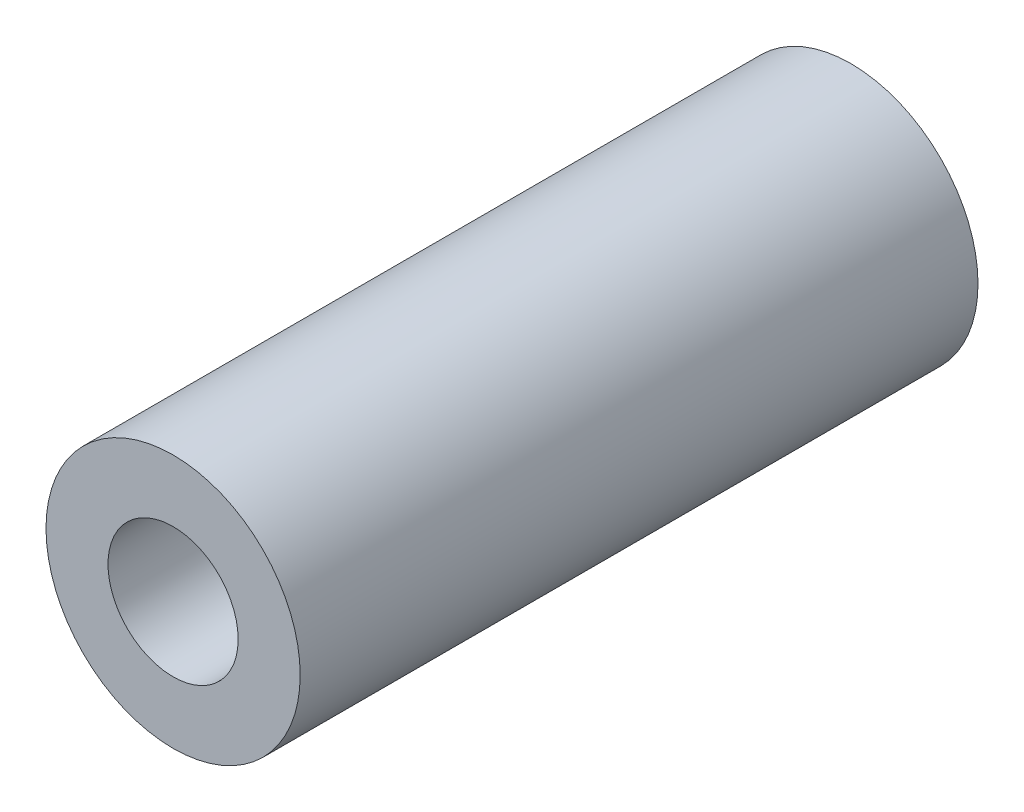
ISO-10303-21;
HEADER;
FILE_DESCRIPTION(('STEP AP214'),'2;1');
FILE_NAME('part.step','',(''),(''),'','','');
FILE_SCHEMA(('AUTOMOTIVE_DESIGN { 1 0 10303 214 1 1 1 1 }'));
ENDSEC;
DATA;
#1=APPLICATION_CONTEXT('core data for automotive mechanical design processes');
#2=APPLICATION_PROTOCOL_DEFINITION('international standard','automotive_design',2000,#1);
#3=PRODUCT_CONTEXT('',#1,'mechanical');
#4=PRODUCT('Part','Part','',(#3));
#5=PRODUCT_RELATED_PRODUCT_CATEGORY('part','',(#4));
#6=PRODUCT_DEFINITION_FORMATION('','',#4);
#7=PRODUCT_DEFINITION_CONTEXT('part definition',#1,'design');
#8=PRODUCT_DEFINITION('design','',#6,#7);
#9=PRODUCT_DEFINITION_SHAPE('','',#8);
#10=(LENGTH_UNIT() NAMED_UNIT(*) SI_UNIT(.MILLI.,.METRE.));
#11=(NAMED_UNIT(*) PLANE_ANGLE_UNIT() SI_UNIT($,.RADIAN.));
#12=(NAMED_UNIT(*) SI_UNIT($,.STERADIAN.) SOLID_ANGLE_UNIT());
#13=UNCERTAINTY_MEASURE_WITH_UNIT(LENGTH_MEASURE(1.E-05),#10,'distance_accuracy_value','');
#14=(GEOMETRIC_REPRESENTATION_CONTEXT(3) GLOBAL_UNCERTAINTY_ASSIGNED_CONTEXT((#13)) GLOBAL_UNIT_ASSIGNED_CONTEXT((#10,
#11,#12)) REPRESENTATION_CONTEXT('',''));
#15=CARTESIAN_POINT('',(0.,0.,0.));
#16=DIRECTION('',(0.,0.,1.));
#17=DIRECTION('',(1.,0.,0.));
#18=AXIS2_PLACEMENT_3D('',#15,#16,#17);
#19=CARTESIAN_POINT('',(0.,4.7625,12.7));
#20=DIRECTION('',(0.,0.,-1.));
#21=DIRECTION('',(-1.,0.,0.));
#22=AXIS2_PLACEMENT_3D('',#19,#20,#21);
#23=PLANE('',#22);
#24=CARTESIAN_POINT('',(0.,0.,12.7));
#25=DIRECTION('',(0.,0.,1.));
#26=DIRECTION('',(1.,0.,0.));
#27=AXIS2_PLACEMENT_3D('',#24,#25,#26);
#28=CIRCLE('',#27,2.4384);
#29=CARTESIAN_POINT('',(2.4384,0.,12.7));
#30=VERTEX_POINT('',#29);
#31=EDGE_CURVE('E10',#30,#30,#28,.T.);
#32=ORIENTED_EDGE('',*,*,#31,.F.);
#33=EDGE_LOOP('',(#32));
#34=FACE_BOUND('',#33,.T.);
#35=CARTESIAN_POINT('',(0.,0.,12.7));
#36=DIRECTION('',(0.,0.,1.));
#37=DIRECTION('',(1.,0.,0.));
#38=AXIS2_PLACEMENT_3D('',#35,#36,#37);
#39=CIRCLE('',#38,4.7625);
#40=CARTESIAN_POINT('',(4.7625,0.,12.7));
#41=VERTEX_POINT('',#40);
#42=EDGE_CURVE('E47',#41,#41,#39,.T.);
#43=ORIENTED_EDGE('',*,*,#42,.T.);
#44=EDGE_LOOP('',(#43));
#45=FACE_BOUND('',#44,.T.);
#46=ADVANCED_FACE('F33',(#34,#45),#23,.F.);
#47=CARTESIAN_POINT('',(0.,0.,43.4651844186562));
#48=DIRECTION('',(0.,0.,1.));
#49=DIRECTION('',(1.,0.,0.));
#50=AXIS2_PLACEMENT_3D('',#47,#48,#49);
#51=CYLINDRICAL_SURFACE('',#50,2.4384);
#52=CARTESIAN_POINT('',(0.,0.,-12.7));
#53=DIRECTION('',(0.,0.,1.));
#54=DIRECTION('',(1.,0.,0.));
#55=AXIS2_PLACEMENT_3D('',#52,#53,#54);
#56=CIRCLE('',#55,2.4384);
#57=CARTESIAN_POINT('',(2.4384,0.,-12.7));
#58=VERTEX_POINT('',#57);
#59=EDGE_CURVE('E39',#58,#58,#56,.T.);
#60=ORIENTED_EDGE('',*,*,#59,.F.);
#61=EDGE_LOOP('',(#60));
#62=FACE_BOUND('',#61,.T.);
#63=ORIENTED_EDGE('',*,*,#31,.T.);
#64=EDGE_LOOP('',(#63));
#65=FACE_BOUND('',#64,.T.);
#66=ADVANCED_FACE('F62',(#62,#65),#51,.F.);
#67=CARTESIAN_POINT('',(0.,4.7625,-12.7));
#68=DIRECTION('',(0.,0.,1.));
#69=DIRECTION('',(1.,0.,0.));
#70=AXIS2_PLACEMENT_3D('',#67,#68,#69);
#71=PLANE('',#70);
#72=CARTESIAN_POINT('',(0.,0.,-12.7));
#73=DIRECTION('',(0.,0.,1.));
#74=DIRECTION('',(1.,0.,0.));
#75=AXIS2_PLACEMENT_3D('',#72,#73,#74);
#76=CIRCLE('',#75,4.7625);
#77=CARTESIAN_POINT('',(4.7625,0.,-12.7));
#78=VERTEX_POINT('',#77);
#79=EDGE_CURVE('E43',#78,#78,#76,.T.);
#80=ORIENTED_EDGE('',*,*,#79,.F.);
#81=EDGE_LOOP('',(#80));
#82=FACE_BOUND('',#81,.T.);
#83=ORIENTED_EDGE('',*,*,#59,.T.);
#84=EDGE_LOOP('',(#83));
#85=FACE_BOUND('',#84,.T.);
#86=ADVANCED_FACE('F57',(#82,#85),#71,.F.);
#87=CARTESIAN_POINT('',(0.,0.,43.4651844186562));
#88=DIRECTION('',(0.,0.,1.));
#89=DIRECTION('',(1.,0.,0.));
#90=AXIS2_PLACEMENT_3D('',#87,#88,#89);
#91=CYLINDRICAL_SURFACE('',#90,4.7625);
#92=ORIENTED_EDGE('',*,*,#42,.F.);
#93=EDGE_LOOP('',(#92));
#94=FACE_BOUND('',#93,.T.);
#95=ORIENTED_EDGE('',*,*,#79,.T.);
#96=EDGE_LOOP('',(#95));
#97=FACE_BOUND('',#96,.T.);
#98=ADVANCED_FACE('F54',(#94,#97),#91,.T.);
#99=CLOSED_SHELL('',(#46,#66,#86,#98));
#100=MANIFOLD_SOLID_BREP('B2',#99);
#101=ADVANCED_BREP_SHAPE_REPRESENTATION('',(#18,#100),#14);
#102=SHAPE_DEFINITION_REPRESENTATION(#9,#101);
ENDSEC;
END-ISO-10303-21;
